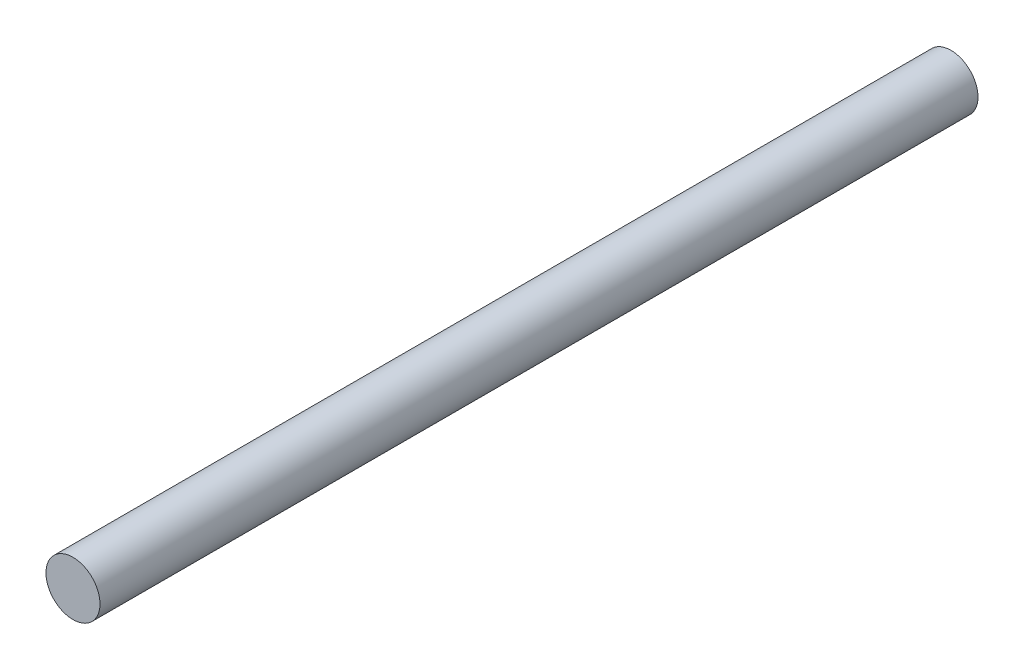
ISO-10303-21;
HEADER;
FILE_DESCRIPTION(('STEP AP214'),'2;1');
FILE_NAME('part.step','',(''),(''),'','','');
FILE_SCHEMA(('AUTOMOTIVE_DESIGN { 1 0 10303 214 1 1 1 1 }'));
ENDSEC;
DATA;
#1=APPLICATION_CONTEXT('core data for automotive mechanical design processes');
#2=APPLICATION_PROTOCOL_DEFINITION('international standard','automotive_design',2000,#1);
#3=PRODUCT_CONTEXT('',#1,'mechanical');
#4=PRODUCT('Part','Part','',(#3));
#5=PRODUCT_RELATED_PRODUCT_CATEGORY('part','',(#4));
#6=PRODUCT_DEFINITION_FORMATION('','',#4);
#7=PRODUCT_DEFINITION_CONTEXT('part definition',#1,'design');
#8=PRODUCT_DEFINITION('design','',#6,#7);
#9=PRODUCT_DEFINITION_SHAPE('','',#8);
#10=(LENGTH_UNIT() NAMED_UNIT(*) SI_UNIT(.MILLI.,.METRE.));
#11=(NAMED_UNIT(*) PLANE_ANGLE_UNIT() SI_UNIT($,.RADIAN.));
#12=(NAMED_UNIT(*) SI_UNIT($,.STERADIAN.) SOLID_ANGLE_UNIT());
#13=UNCERTAINTY_MEASURE_WITH_UNIT(LENGTH_MEASURE(1.E-05),#10,'distance_accuracy_value','');
#14=(GEOMETRIC_REPRESENTATION_CONTEXT(3) GLOBAL_UNCERTAINTY_ASSIGNED_CONTEXT((#13)) GLOBAL_UNIT_ASSIGNED_CONTEXT((#10,
#11,#12)) REPRESENTATION_CONTEXT('',''));
#15=CARTESIAN_POINT('',(0.,0.,0.));
#16=DIRECTION('',(0.,0.,1.));
#17=DIRECTION('',(1.,0.,0.));
#18=AXIS2_PLACEMENT_3D('',#15,#16,#17);
#19=CARTESIAN_POINT('',(0.,0.,130.));
#20=DIRECTION('',(0.,0.,-1.));
#21=DIRECTION('',(-1.,0.,0.));
#22=AXIS2_PLACEMENT_3D('',#19,#20,#21);
#23=CYLINDRICAL_SURFACE('',#22,4.);
#24=CARTESIAN_POINT('',(0.,0.,130.));
#25=DIRECTION('',(0.,0.,1.));
#26=DIRECTION('',(1.,0.,0.));
#27=AXIS2_PLACEMENT_3D('',#24,#25,#26);
#28=CIRCLE('',#27,4.);
#29=CARTESIAN_POINT('',(4.,0.,130.));
#30=VERTEX_POINT('',#29);
#31=EDGE_CURVE('E10',#30,#30,#28,.T.);
#32=ORIENTED_EDGE('',*,*,#31,.F.);
#33=EDGE_LOOP('',(#32));
#34=FACE_BOUND('',#33,.T.);
#35=CARTESIAN_POINT('',(0.,0.,0.));
#36=DIRECTION('',(0.,0.,1.));
#37=DIRECTION('',(1.,0.,0.));
#38=AXIS2_PLACEMENT_3D('',#35,#36,#37);
#39=CIRCLE('',#38,4.);
#40=CARTESIAN_POINT('',(4.,0.,0.));
#41=VERTEX_POINT('',#40);
#42=EDGE_CURVE('E34',#41,#41,#39,.T.);
#43=ORIENTED_EDGE('',*,*,#42,.T.);
#44=EDGE_LOOP('',(#43));
#45=FACE_BOUND('',#44,.T.);
#46=ADVANCED_FACE('F31',(#34,#45),#23,.T.);
#47=CARTESIAN_POINT('',(0.,0.,130.));
#48=DIRECTION('',(0.,0.,1.));
#49=DIRECTION('',(1.,0.,0.));
#50=AXIS2_PLACEMENT_3D('',#47,#48,#49);
#51=PLANE('',#50);
#52=ORIENTED_EDGE('',*,*,#31,.T.);
#53=EDGE_LOOP('',(#52));
#54=FACE_BOUND('',#53,.T.);
#55=ADVANCED_FACE('F46',(#54),#51,.T.);
#56=CARTESIAN_POINT('',(0.,0.,0.));
#57=DIRECTION('',(0.,0.,1.));
#58=DIRECTION('',(1.,0.,0.));
#59=AXIS2_PLACEMENT_3D('',#56,#57,#58);
#60=PLANE('',#59);
#61=ORIENTED_EDGE('',*,*,#42,.F.);
#62=EDGE_LOOP('',(#61));
#63=FACE_BOUND('',#62,.T.);
#64=ADVANCED_FACE('F44',(#63),#60,.F.);
#65=CLOSED_SHELL('',(#46,#55,#64));
#66=MANIFOLD_SOLID_BREP('B2',#65);
#67=ADVANCED_BREP_SHAPE_REPRESENTATION('',(#18,#66),#14);
#68=SHAPE_DEFINITION_REPRESENTATION(#9,#67);
ENDSEC;
END-ISO-10303-21;
